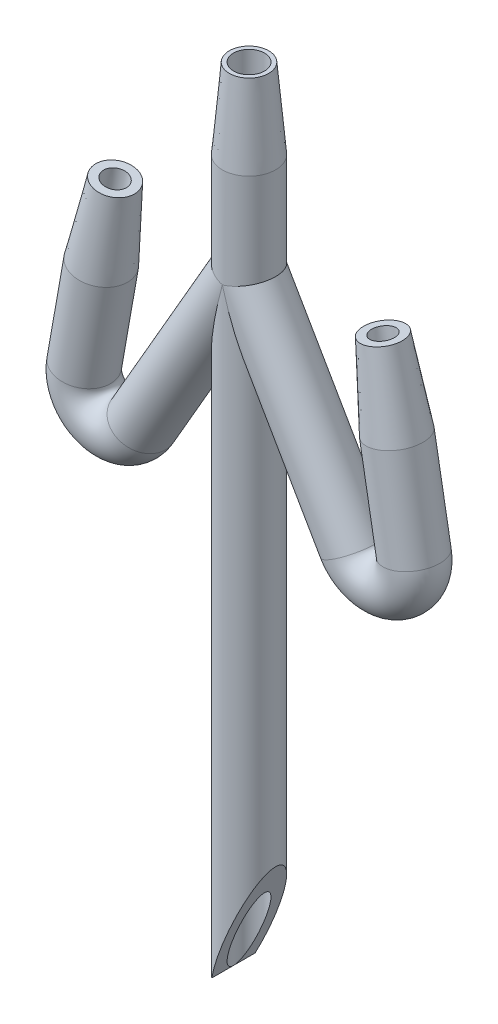
ISO-10303-21;
HEADER;
FILE_DESCRIPTION(('STEP AP214'),'2;1');
FILE_NAME('part.step','',(''),(''),'','','');
FILE_SCHEMA(('AUTOMOTIVE_DESIGN { 1 0 10303 214 1 1 1 1 }'));
ENDSEC;
DATA;
#1=APPLICATION_CONTEXT('core data for automotive mechanical design processes');
#2=APPLICATION_PROTOCOL_DEFINITION('international standard','automotive_design',2000,#1);
#3=PRODUCT_CONTEXT('',#1,'mechanical');
#4=PRODUCT('Part','Part','',(#3));
#5=PRODUCT_RELATED_PRODUCT_CATEGORY('part','',(#4));
#6=PRODUCT_DEFINITION_FORMATION('','',#4);
#7=PRODUCT_DEFINITION_CONTEXT('part definition',#1,'design');
#8=PRODUCT_DEFINITION('design','',#6,#7);
#9=PRODUCT_DEFINITION_SHAPE('','',#8);
#10=(LENGTH_UNIT() NAMED_UNIT(*) SI_UNIT(.MILLI.,.METRE.));
#11=(NAMED_UNIT(*) PLANE_ANGLE_UNIT() SI_UNIT($,.RADIAN.));
#12=(NAMED_UNIT(*) SI_UNIT($,.STERADIAN.) SOLID_ANGLE_UNIT());
#13=UNCERTAINTY_MEASURE_WITH_UNIT(LENGTH_MEASURE(1.E-05),#10,'distance_accuracy_value','');
#14=(GEOMETRIC_REPRESENTATION_CONTEXT(3) GLOBAL_UNCERTAINTY_ASSIGNED_CONTEXT((#13)) GLOBAL_UNIT_ASSIGNED_CONTEXT((#10,
#11,#12)) REPRESENTATION_CONTEXT('',''));
#15=CARTESIAN_POINT('',(0.,0.,0.));
#16=DIRECTION('',(0.,0.,1.));
#17=DIRECTION('',(1.,0.,0.));
#18=AXIS2_PLACEMENT_3D('',#15,#16,#17);
#19=CARTESIAN_POINT('',(0.,88.9,0.));
#20=DIRECTION('',(0.,-1.,0.));
#21=DIRECTION('',(0.,0.,-1.));
#22=AXIS2_PLACEMENT_3D('',#19,#20,#21);
#23=CYLINDRICAL_SURFACE('',#22,3.);
#24=CARTESIAN_POINT('',(0.,79.9,0.));
#25=DIRECTION('',(0.,1.,0.));
#26=DIRECTION('',(0.,0.,1.));
#27=AXIS2_PLACEMENT_3D('',#24,#25,#26);
#28=CIRCLE('',#27,3.);
#29=CARTESIAN_POINT('',(0.,79.9,3.));
#30=VERTEX_POINT('',#29);
#31=EDGE_CURVE('E11',#30,#30,#28,.F.);
#32=ORIENTED_EDGE('',*,*,#31,.T.);
#33=EDGE_LOOP('',(#32));
#34=FACE_BOUND('',#33,.T.);
#35=CARTESIAN_POINT('',(0.,68.6961524227066,0.));
#36=DIRECTION('',(0.258819045102523,-0.965925826289068,0.));
#37=DIRECTION('',(0.965925826289068,0.258819045102523,0.));
#38=AXIS2_PLACEMENT_3D('',#35,#36,#37);
#39=ELLIPSE('',#38,3.10582854123025,3.);
#40=CARTESIAN_POINT('',(0.,68.6961524227065,3.));
#41=VERTEX_POINT('',#40);
#42=CARTESIAN_POINT('',(0.,68.6961524227066,-3.));
#43=VERTEX_POINT('',#42);
#44=EDGE_CURVE('E79',#41,#43,#39,.F.);
#45=ORIENTED_EDGE('',*,*,#44,.T.);
#46=CARTESIAN_POINT('',(0.,68.6961524227065,0.));
#47=DIRECTION('',(-0.258819045102523,-0.965925826289068,0.));
#48=DIRECTION('',(-0.965925826289068,0.258819045102523,0.));
#49=AXIS2_PLACEMENT_3D('',#46,#47,#48);
#50=ELLIPSE('',#49,3.10582854123025,3.);
#51=EDGE_CURVE('E70',#41,#43,#50,.T.);
#52=ORIENTED_EDGE('',*,*,#51,.F.);
#53=EDGE_LOOP('',(#45,#52));
#54=FACE_BOUND('',#53,.T.);
#55=ADVANCED_FACE('F32',(#34,#54),#23,.T.);
#56=CARTESIAN_POINT('',(0.,4.42105263157895,0.));
#57=DIRECTION('',(0.929806613071272,-0.368048451007378,0.));
#58=DIRECTION('',(-0.368048451007378,-0.929806613071272,0.));
#59=AXIS2_PLACEMENT_3D('',#56,#57,#58);
#60=ELLIPSE('',#59,8.15110073629914,3.);
#61=CARTESIAN_POINT('',(-1.75,0.,-2.43669858620224));
#62=VERTEX_POINT('',#61);
#63=CARTESIAN_POINT('',(-1.75,0.,2.43669858620224));
#64=VERTEX_POINT('',#63);
#65=EDGE_CURVE('E47',#62,#64,#60,.T.);
#66=ORIENTED_EDGE('',*,*,#65,.F.);
#67=CARTESIAN_POINT('',(0.,0.,0.));
#68=DIRECTION('',(0.,1.,0.));
#69=DIRECTION('',(0.,0.,1.));
#70=AXIS2_PLACEMENT_3D('',#67,#68,#69);
#71=CIRCLE('',#70,3.);
#72=EDGE_CURVE('E196',#62,#64,#71,.T.);
#73=ORIENTED_EDGE('',*,*,#72,.T.);
#74=EDGE_LOOP('',(#66,#73));
#75=FACE_BOUND('',#74,.T.);
#76=CARTESIAN_POINT('',(0.,68.6961524227066,0.));
#77=DIRECTION('',(0.965925826289068,0.258819045102523,0.));
#78=DIRECTION('',(0.258819045102523,-0.965925826289068,0.));
#79=AXIS2_PLACEMENT_3D('',#76,#77,#78);
#80=ELLIPSE('',#79,11.5911099154687,3.);
#81=EDGE_CURVE('E66',#43,#41,#80,.F.);
#82=ORIENTED_EDGE('',*,*,#81,.T.);
#83=CARTESIAN_POINT('',(0.,68.6961524227065,0.));
#84=DIRECTION('',(-0.965925826289068,0.258819045102523,0.));
#85=DIRECTION('',(-0.258819045102523,-0.965925826289068,0.));
#86=AXIS2_PLACEMENT_3D('',#83,#84,#85);
#87=ELLIPSE('',#86,11.5911099154687,3.);
#88=EDGE_CURVE('E62',#43,#41,#87,.T.);
#89=ORIENTED_EDGE('',*,*,#88,.F.);
#90=EDGE_LOOP('',(#82,#89));
#91=FACE_BOUND('',#90,.T.);
#92=ADVANCED_FACE('F64',(#75,#91),#23,.T.);
#93=CARTESIAN_POINT('',(0.,88.9,0.));
#94=DIRECTION('',(0.,-1.,0.));
#95=DIRECTION('',(0.,0.,-1.));
#96=AXIS2_PLACEMENT_3D('',#93,#94,#95);
#97=CYLINDRICAL_SURFACE('',#96,1.75);
#98=CARTESIAN_POINT('',(0.,4.42105263157895,0.));
#99=DIRECTION('',(0.929806613071272,-0.368048451007378,0.));
#100=DIRECTION('',(-0.368048451007378,-0.929806613071272,0.));
#101=AXIS2_PLACEMENT_3D('',#98,#99,#100);
#102=ELLIPSE('',#101,4.75480876284117,1.75);
#103=CARTESIAN_POINT('',(-1.75,0.,0.));
#104=VERTEX_POINT('',#103);
#105=EDGE_CURVE('E52',#104,#104,#102,.T.);
#106=ORIENTED_EDGE('',*,*,#105,.T.);
#107=EDGE_LOOP('',(#106));
#108=FACE_BOUND('',#107,.T.);
#109=CARTESIAN_POINT('',(0.,88.9,0.));
#110=DIRECTION('',(0.,1.,0.));
#111=DIRECTION('',(0.,0.,1.));
#112=AXIS2_PLACEMENT_3D('',#109,#110,#111);
#113=CIRCLE('',#112,1.75);
#114=CARTESIAN_POINT('',(0.,88.9,1.75));
#115=VERTEX_POINT('',#114);
#116=EDGE_CURVE('E194',#115,#115,#113,.T.);
#117=ORIENTED_EDGE('',*,*,#116,.T.);
#118=EDGE_LOOP('',(#117));
#119=FACE_BOUND('',#118,.T.);
#120=CARTESIAN_POINT('',(-1.75,64.4650635094611,0.));
#121=CARTESIAN_POINT('',(-1.74999967782924,64.4650657963155,0.0144022437630937));
#122=CARTESIAN_POINT('',(-1.74981974344436,64.4664259852177,0.028817126801205));
#123=CARTESIAN_POINT('',(-1.74912392319116,64.4716996002133,0.057166727863634));
#124=CARTESIAN_POINT('',(-1.74860743427616,64.4756176094959,0.071100536605041));
#125=CARTESIAN_POINT('',(-1.74713179830254,64.4868583619929,0.101581459482267));
#126=CARTESIAN_POINT('',(-1.74609364841494,64.494792266152,0.117896127350237));
#127=CARTESIAN_POINT('',(-1.74371213439526,64.5131246485248,0.149041325044871));
#128=CARTESIAN_POINT('',(-1.74236811009864,64.5235284596325,0.163868543307113));
#129=CARTESIAN_POINT('',(-1.73847370889731,64.5539401708528,0.201974704230325));
#130=CARTESIAN_POINT('',(-1.73573678193026,64.5755780255174,0.223916830563885));
#131=CARTESIAN_POINT('',(-1.73001423295078,64.6216746361816,0.264519343772491));
#132=CARTESIAN_POINT('',(-1.72702794756075,64.6461409879227,0.283170537535171));
#133=CARTESIAN_POINT('',(-1.72071851775594,64.6989616724662,0.319362822507982));
#134=CARTESIAN_POINT('',(-1.71738829230658,64.7274697518859,0.336675400950524));
#135=CARTESIAN_POINT('',(-1.71075351391463,64.7858246439376,0.368905034696997));
#136=CARTESIAN_POINT('',(-1.70744899422182,64.8156729324553,0.383819361871916));
#137=CARTESIAN_POINT('',(-1.6976782474501,64.9067363898538,0.425702937997383));
#138=CARTESIAN_POINT('',(-1.69137264560294,64.9693236952528,0.449720997913106));
#139=CARTESIAN_POINT('',(-1.6793166815534,65.0994500211433,0.492857070926406));
#140=CARTESIAN_POINT('',(-1.67360665322866,65.1670832623893,0.511689803237972));
#141=CARTESIAN_POINT('',(-1.66342241251904,65.303804687399,0.543884454011277));
#142=CARTESIAN_POINT('',(-1.65894960268057,65.3728944276179,0.557240171778001));
#143=CARTESIAN_POINT('',(-1.65157896400475,65.511845128919,0.578717844059665));
#144=CARTESIAN_POINT('',(-1.64867853480283,65.5817046205316,0.586848443902411));
#145=CARTESIAN_POINT('',(-1.64478812432287,65.7218433567063,0.597667222140363));
#146=CARTESIAN_POINT('',(-1.64379622005349,65.792122107115,0.60036087882447));
#147=CARTESIAN_POINT('',(-1.64408681387714,65.9318599544533,0.599566257573265));
#148=CARTESIAN_POINT('',(-1.64534335767751,66.0013192077901,0.596148524963205));
#149=CARTESIAN_POINT('',(-1.6504399951481,66.1394149322064,0.581905835443533));
#150=CARTESIAN_POINT('',(-1.65427791617976,66.2080520458413,0.571087107515163));
#151=CARTESIAN_POINT('',(-1.66365031217651,66.3289667916924,0.543078855272738));
#152=CARTESIAN_POINT('',(-1.66866853228566,66.3816875383998,0.527673695348891));
#153=CARTESIAN_POINT('',(-1.68034243132295,66.4841257498108,0.489245928747003));
#154=CARTESIAN_POINT('',(-1.68699431584352,66.5338498460064,0.466240931588176));
#155=CARTESIAN_POINT('',(-1.69862860468098,66.6100000403414,0.421273816173346));
#156=CARTESIAN_POINT('',(-1.70329807998176,66.6381553905885,0.40217308471599));
#157=CARTESIAN_POINT('',(-1.71271968125644,66.6912695341783,0.35994413337159));
#158=CARTESIAN_POINT('',(-1.71747168735932,66.7162325844332,0.336821376089838));
#159=CARTESIAN_POINT('',(-1.72574204118773,66.7574674990413,0.291113834815033));
#160=CARTESIAN_POINT('',(-1.72932570825414,66.7744925865,0.2692250164275));
#161=CARTESIAN_POINT('',(-1.73590738815141,66.8047703933485,0.222872116911661));
#162=CARTESIAN_POINT('',(-1.7389056164695,66.8180245015777,0.198408988452455));
#163=CARTESIAN_POINT('',(-1.74399094456511,66.8400463397497,0.14717972819608));
#164=CARTESIAN_POINT('',(-1.74607024804382,66.8487757855542,0.120396112701944));
#165=CARTESIAN_POINT('',(-1.74898507238961,66.8609168844585,0.065583223951246));
#166=CARTESIAN_POINT('',(-1.74982162024855,66.8643329285719,0.0375549989697012));
#167=CARTESIAN_POINT('',(-1.75010593362122,66.8654970923788,-0.0147173541198623));
#168=CARTESIAN_POINT('',(-1.74973023081741,66.8639656397361,-0.0389471353331247));
#169=CARTESIAN_POINT('',(-1.74801137034396,66.8568669643391,-0.0867655994173777));
#170=CARTESIAN_POINT('',(-1.74666836993793,66.8513003976144,-0.110354385854697));
#171=CARTESIAN_POINT('',(-1.74320086860381,66.8366191889956,-0.155752537929573));
#172=CARTESIAN_POINT('',(-1.74109406256437,66.8275846305288,-0.177589502407519));
#173=CARTESIAN_POINT('',(-1.73629328790374,66.8064141769206,-0.219622299385194));
#174=CARTESIAN_POINT('',(-1.73359911324072,66.7942771932276,-0.23981755257087));
#175=CARTESIAN_POINT('',(-1.72670107353083,66.7620996335445,-0.285902764125763));
#176=CARTESIAN_POINT('',(-1.72232023456567,66.7408280883915,-0.310907894281748));
#177=CARTESIAN_POINT('',(-1.71334347660722,66.6945081057977,-0.357085275280826));
#178=CARTESIAN_POINT('',(-1.70874713432729,66.6694520004632,-0.378249548002124));
#179=CARTESIAN_POINT('',(-1.6977013621842,66.6047807735987,-0.425611455051361));
#180=CARTESIAN_POINT('',(-1.69134763470024,66.5636838727508,-0.449795503742886));
#181=CARTESIAN_POINT('',(-1.67967484782126,66.4781836065856,-0.491590398474707));
#182=CARTESIAN_POINT('',(-1.67435761599303,66.4337745884773,-0.509189683477354));
#183=CARTESIAN_POINT('',(-1.66573692985128,66.350173400741,-0.536647586104307));
#184=CARTESIAN_POINT('',(-1.66224872627558,66.3112481436257,-0.547285452423902));
#185=CARTESIAN_POINT('',(-1.65620903896644,66.232567689766,-0.565296256616595));
#186=CARTESIAN_POINT('',(-1.65365822710848,66.192811919237,-0.572666853451822));
#187=CARTESIAN_POINT('',(-1.64736379043802,66.0726138691492,-0.590651258660524));
#188=CARTESIAN_POINT('',(-1.6450006695552,65.9914648611183,-0.597071486330873));
#189=CARTESIAN_POINT('',(-1.64354572730632,65.8400639359947,-0.601038335238441));
#190=CARTESIAN_POINT('',(-1.64405380881221,65.769826322438,-0.599670059278626));
#191=CARTESIAN_POINT('',(-1.64705291775742,65.6296526102127,-0.591386832212747));
#192=CARTESIAN_POINT('',(-1.6495458708731,65.559716870696,-0.584466494575411));
#193=CARTESIAN_POINT('',(-1.65615795336084,65.4208571001336,-0.565456213214872));
#194=CARTESIAN_POINT('',(-1.66027214776122,65.3519306511458,-0.553381948573587));
#195=CARTESIAN_POINT('',(-1.66980203777916,65.2153616804124,-0.523932262522137));
#196=CARTESIAN_POINT('',(-1.67521636364355,65.1477178877165,-0.506562415113301));
#197=CARTESIAN_POINT('',(-1.68470029414649,65.0406157051937,-0.473760402469363));
#198=CARTESIAN_POINT('',(-1.68846082385498,65.000539242412,-0.46025476757722));
#199=CARTESIAN_POINT('',(-1.69626381067554,64.9213191585745,-0.430609503515983));
#200=CARTESIAN_POINT('',(-1.70030672978824,64.8821772137475,-0.414465497194957));
#201=CARTESIAN_POINT('',(-1.70917110193847,64.7996974630063,-0.376401145512029));
#202=CARTESIAN_POINT('',(-1.71401997415626,64.7565826320717,-0.353981401601094));
#203=CARTESIAN_POINT('',(-1.72124973074329,64.6945405033158,-0.316164290400013));
#204=CARTESIAN_POINT('',(-1.72364873283184,64.6743272385583,-0.30288430735564));
#205=CARTESIAN_POINT('',(-1.72837529579794,64.6351191466309,-0.274636346716059));
#206=CARTESIAN_POINT('',(-1.73070293919485,64.6161228820882,-0.25967042023995));
#207=CARTESIAN_POINT('',(-1.7347410569793,64.5836021615469,-0.230950631440091));
#208=CARTESIAN_POINT('',(-1.73648052091051,64.5697523185699,-0.217573002687915));
#209=CARTESIAN_POINT('',(-1.73979207189458,64.5436222332122,-0.189279382761899));
#210=CARTESIAN_POINT('',(-1.7413639152341,64.5313442712202,-0.174361212059098));
#211=CARTESIAN_POINT('',(-1.74425619128716,64.508912980605,-0.142581292483764));
#212=CARTESIAN_POINT('',(-1.7455722125284,64.4987966767122,-0.125692331011889));
#213=CARTESIAN_POINT('',(-1.74775963202233,64.4820602614523,-0.0902536819768896));
#214=CARTESIAN_POINT('',(-1.74863334180382,64.4754219674309,-0.071713236480717));
#215=CARTESIAN_POINT('',(-1.74946750946716,64.4690947872168,-0.0440323183079523));
#216=CARTESIAN_POINT('',(-1.7496660906405,64.4675908392054,-0.035298464424195));
#217=CARTESIAN_POINT('',(-1.74993245191926,64.4655743686878,-0.0177113543209565));
#218=CARTESIAN_POINT('',(-1.75000019815041,64.4650621029364,-0.00885806777664132));
#219=CARTESIAN_POINT('',(-1.75,64.4650635094611,0.));
#220=B_SPLINE_CURVE_WITH_KNOTS('',3,(#120,#121,#122,#123,#124,#125,#126,#127,#128,#129,#130,
#131,#132,#133,#134,#135,#136,#137,#138,#139,#140,#141,#142,#143,#144,#145,#146,#147,#148,#149,
#150,#151,#152,#153,#154,#155,#156,#157,#158,#159,#160,#161,#162,#163,#164,#165,#166,#167,#168,
#169,#170,#171,#172,#173,#174,#175,#176,#177,#178,#179,#180,#181,#182,#183,#184,#185,#186,#187,
#188,#189,#190,#191,#192,#193,#194,#195,#196,#197,#198,#199,#200,#201,#202,#203,#204,#205,#206,
#207,#208,#209,#210,#211,#212,#213,#214,#215,#216,#217,#218,#219),.UNSPECIFIED.,.T.,.F.,(4,2,2,
2,2,2,2,2,2,2,2,2,2,2,2,2,2,2,2,2,2,2,2,2,2,2,2,2,2,2,2,2,2,2,2,2,2,2,2,2,2,2,2,2,2,2,2,2,2,4),
(0.,0.0431678813126581,0.0864133253845893,0.140616642509254,0.194938074409648,0.287230089916701,
0.379775973337152,0.480175259794171,0.580687959565218,0.782230177273864,0.993298968153461,
1.20460606110381,1.41556262517877,1.62630652212627,1.83463343054168,2.04278521785444,
2.2078104961902,2.3724560468518,2.47518317624196,2.57777185860341,2.66132906720018,
2.74485546199336,2.82907750601135,2.91322991159056,2.98571031889228,3.05817894496107,
3.12906603577782,3.19997803305763,3.2987842777245,3.39779346773517,3.54130612177943,
3.68506957526258,3.80640587989593,3.92782898347716,4.1713716785466,4.3818936442656,
4.59262010275024,4.80271001548285,5.01257955173248,5.13987576509654,5.26738535221526,
5.41353284256939,5.4863827352241,5.55914493682069,5.61705365266178,5.67504544922731,
5.73396252108456,5.79256842763841,5.81911186497616,5.84566217371495),.UNSPECIFIED.);
#221=CARTESIAN_POINT('',(-1.75,64.4650635094611,0.));
#222=VERTEX_POINT('',#221);
#223=EDGE_CURVE('E69',#222,#222,#220,.T.);
#224=ORIENTED_EDGE('',*,*,#223,.T.);
#225=EDGE_LOOP('',(#224));
#226=FACE_BOUND('',#225,.T.);
#227=CARTESIAN_POINT('',(1.75,66.8650635094611,0.));
#228=CARTESIAN_POINT('',(1.74999934538002,66.8650618865602,-0.0257575407768746));
#229=CARTESIAN_POINT('',(1.74942442113619,66.8627154326438,-0.0515261011185308));
#230=CARTESIAN_POINT('',(1.74719833649222,66.8534886163495,-0.102192129925877));
#231=CARTESIAN_POINT('',(1.74554638092465,66.8466049040928,-0.127088940461113));
#232=CARTESIAN_POINT('',(1.7413799173201,66.8287985725914,-0.175144406933154));
#233=CARTESIAN_POINT('',(1.73887009421107,66.8178978659364,-0.198311687807514));
#234=CARTESIAN_POINT('',(1.73324839636274,66.7926564765402,-0.24258874115657));
#235=CARTESIAN_POINT('',(1.73013631111688,66.7783145905941,-0.263697790333941));
#236=CARTESIAN_POINT('',(1.72240279014223,66.7411843579435,-0.310782113369198));
#237=CARTESIAN_POINT('',(1.7176396472944,66.7172097424317,-0.335797170050267));
#238=CARTESIAN_POINT('',(1.70805036903912,66.6655304057504,-0.381592486445967));
#239=CARTESIAN_POINT('',(1.70322412814084,66.6378184391157,-0.402364318209808));
#240=CARTESIAN_POINT('',(1.69161815192663,66.5656324420249,-0.44918823788523));
#241=CARTESIAN_POINT('',(1.68503751952363,66.5195894198462,-0.472853726291026));
#242=CARTESIAN_POINT('',(1.67325022865103,66.4243421609894,-0.512997881117648));
#243=CARTESIAN_POINT('',(1.66804649332589,66.3751314702249,-0.529461305212746));
#244=CARTESIAN_POINT('',(1.65979460457016,66.2818542853663,-0.554733666424952));
#245=CARTESIAN_POINT('',(1.6565496349464,66.2379973292984,-0.564278700157163));
#246=CARTESIAN_POINT('',(1.65119964699118,66.1495631707262,-0.579746951244563));
#247=CARTESIAN_POINT('',(1.64909550308267,66.1049854426365,-0.585667390859475));
#248=CARTESIAN_POINT('',(1.64595653419576,66.0154053671219,-0.594430939318128));
#249=CARTESIAN_POINT('',(1.64492403926963,65.9704023082446,-0.597267343275287));
#250=CARTESIAN_POINT('',(1.64384212407438,65.8802905487562,-0.600237197008605));
#251=CARTESIAN_POINT('',(1.64379302307328,65.8351818185914,-0.600369768960714));
#252=CARTESIAN_POINT('',(1.64481819660683,65.7176052125877,-0.597561408600811));
#253=CARTESIAN_POINT('',(1.64659396099089,65.6451856440457,-0.592701885508357));
#254=CARTESIAN_POINT('',(1.65203618798909,65.500954627757,-0.577357578287653));
#255=CARTESIAN_POINT('',(1.65570475693604,65.4291439482669,-0.566866526808951));
#256=CARTESIAN_POINT('',(1.6645811036273,65.2864100025921,-0.540247653524163));
#257=CARTESIAN_POINT('',(1.66979421947631,65.2154907181907,-0.524100246924415));
#258=CARTESIAN_POINT('',(1.68139499786975,65.0755122380681,-0.485617928730619));
#259=CARTESIAN_POINT('',(1.68778065334857,65.0064500915764,-0.463293557797646));
#260=CARTESIAN_POINT('',(1.69776155402201,64.9068735014531,-0.424578439273093));
#261=CARTESIAN_POINT('',(1.70106292452785,64.8751463026504,-0.411220299062858));
#262=CARTESIAN_POINT('',(1.7077747200552,64.8126851306941,-0.382395424072146));
#263=CARTESIAN_POINT('',(1.71118507075887,64.7819505082545,-0.366930103723636));
#264=CARTESIAN_POINT('',(1.71799837463481,64.72219473961,-0.333570370171906));
#265=CARTESIAN_POINT('',(1.72140109616355,64.6931602056094,-0.315700149366866));
#266=CARTESIAN_POINT('',(1.72809127734644,64.6373475935098,-0.276754362523848));
#267=CARTESIAN_POINT('',(1.73137905983095,64.6105628386826,-0.255688842107469));
#268=CARTESIAN_POINT('',(1.73637062482275,64.5706099451569,-0.218441118002573));
#269=CARTESIAN_POINT('',(1.73818930679799,64.5562260004327,-0.203591192282659));
#270=CARTESIAN_POINT('',(1.7415925308873,64.5295501332762,-0.172066055468619));
#271=CARTESIAN_POINT('',(1.74317734641042,64.5172557653631,-0.155393016106747));
#272=CARTESIAN_POINT('',(1.74559647275767,64.4986114313716,-0.124748850239635));
#273=CARTESIAN_POINT('',(1.74651849456416,64.4915488022983,-0.111224111834521));
#274=CARTESIAN_POINT('',(1.74807694799196,64.4796509362076,-0.0832050392670694));
#275=CARTESIAN_POINT('',(1.74871372101098,64.4748130363559,-0.0687118881560488));
#276=CARTESIAN_POINT('',(1.74963185805639,64.4678475026655,-0.0388902349003573));
#277=CARTESIAN_POINT('',(1.74990930503509,64.4657497372161,-0.0235543952829279));
#278=CARTESIAN_POINT('',(1.75005261076731,64.4646654124039,0.00722685785613545));
#279=CARTESIAN_POINT('',(1.74991868847577,64.4656771979551,0.0226722087230651));
#280=CARTESIAN_POINT('',(1.74931103973881,64.470280897802,0.0507854892331671));
#281=CARTESIAN_POINT('',(1.74889083383159,64.4734665438656,0.0635247530253516));
#282=CARTESIAN_POINT('',(1.74781123078052,64.4816792142304,0.0883787410373905));
#283=CARTESIAN_POINT('',(1.74715169776646,64.4867072845241,0.100493106020216));
#284=CARTESIAN_POINT('',(1.74520480871955,64.5016169632943,0.130793059372627));
#285=CARTESIAN_POINT('',(1.74377537057684,64.5126208369048,0.148413780365441));
#286=CARTESIAN_POINT('',(1.74061676141902,64.5371702776817,0.181755078529164));
#287=CARTESIAN_POINT('',(1.73888665633346,64.5507237768255,0.197469467068716));
#288=CARTESIAN_POINT('',(1.73370585127386,64.5917742605029,0.239874680694661));
#289=CARTESIAN_POINT('',(1.73004369685245,64.6213229758475,0.264528293797423));
#290=CARTESIAN_POINT('',(1.72254784183696,64.6834185897705,0.309589845672081));
#291=CARTESIAN_POINT('',(1.71871371008473,64.7159732685904,0.329986294711524));
#292=CARTESIAN_POINT('',(1.71054807150105,64.7874818202774,0.370135464908219));
#293=CARTESIAN_POINT('',(1.70622070450837,64.8266999126403,0.389413605797098));
#294=CARTESIAN_POINT('',(1.69776910892759,64.9066031949571,0.424744452908575));
#295=CARTESIAN_POINT('',(1.69364512591398,64.9472900604851,0.440793328640382));
#296=CARTESIAN_POINT('',(1.68570094152312,65.029791567652,0.470261091045478));
#297=CARTESIAN_POINT('',(1.68188187802218,65.0716097189519,0.483670377394763));
#298=CARTESIAN_POINT('',(1.6746529576022,65.1559679862871,0.508132980315417));
#299=CARTESIAN_POINT('',(1.67124321576486,65.1985083015411,0.519185634989252));
#300=CARTESIAN_POINT('',(1.6629064222857,65.311287454928,0.545470539419672));
#301=CARTESIAN_POINT('',(1.65838873197447,65.3819806242935,0.558907274562822));
#302=CARTESIAN_POINT('',(1.65100814919969,65.5243371317287,0.580343478652644));
#303=CARTESIAN_POINT('',(1.64814690853357,65.5960013655277,0.588337521586388));
#304=CARTESIAN_POINT('',(1.64446770662024,65.7394291987085,0.598544525461276));
#305=CARTESIAN_POINT('',(1.64363911473192,65.8111903086648,0.600787566622349));
#306=CARTESIAN_POINT('',(1.64439560911279,65.9545507896087,0.598723848832535));
#307=CARTESIAN_POINT('',(1.64597685908977,66.0261502363244,0.59442750012642));
#308=CARTESIAN_POINT('',(1.65099382510893,66.1461645731549,0.580304434537673));
#309=CARTESIAN_POINT('',(1.65369894390747,66.1948577762831,0.572615863203927));
#310=CARTESIAN_POINT('',(1.66050750597454,66.2912538600305,0.552566620504301));
#311=CARTESIAN_POINT('',(1.6646120394951,66.3389559376517,0.540202305551058));
#312=CARTESIAN_POINT('',(1.67423426233342,66.43287165497,0.509609798320321));
#313=CARTESIAN_POINT('',(1.67976549973945,66.4790659566293,0.491324933680913));
#314=CARTESIAN_POINT('',(1.69194199668638,66.5678089004697,0.447604531800282));
#315=CARTESIAN_POINT('',(1.69858427385198,66.6103668535861,0.422188017563));
#316=CARTESIAN_POINT('',(1.70960044903773,66.6741235159477,0.374316006910273));
#317=CARTESIAN_POINT('',(1.71387153407894,66.6972709666108,0.354438669083627));
#318=CARTESIAN_POINT('',(1.72222163354269,66.7402795249136,0.311341883741537));
#319=CARTESIAN_POINT('',(1.72630084356238,66.7601440335043,0.288125942077593));
#320=CARTESIAN_POINT('',(1.73330060305539,66.7929482951715,0.242130290096613));
#321=CARTESIAN_POINT('',(1.7363033472384,66.8064761889424,0.219784944346833));
#322=CARTESIAN_POINT('',(1.74157569900104,66.8296891132586,0.173098432180861));
#323=CARTESIAN_POINT('',(1.7438461530937,66.839378583926,0.148759611308967));
#324=CARTESIAN_POINT('',(1.74703930407707,66.8528363992621,0.103715498630748));
#325=CARTESIAN_POINT('',(1.74814091429722,66.8574022282336,0.083259562672463));
#326=CARTESIAN_POINT('',(1.74962154345115,66.8635165060842,0.041871525247048));
#327=CARTESIAN_POINT('',(1.75000053216851,66.8650648287864,0.0209394039052619));
#328=CARTESIAN_POINT('',(1.75,66.8650635094611,0.));
#329=B_SPLINE_CURVE_WITH_KNOTS('',3,(#227,#228,#229,#230,#231,#232,#233,#234,#235,#236,#237,
#238,#239,#240,#241,#242,#243,#244,#245,#246,#247,#248,#249,#250,#251,#252,#253,#254,#255,#256,
#257,#258,#259,#260,#261,#262,#263,#264,#265,#266,#267,#268,#269,#270,#271,#272,#273,#274,#275,
#276,#277,#278,#279,#280,#281,#282,#283,#284,#285,#286,#287,#288,#289,#290,#291,#292,#293,#294,
#295,#296,#297,#298,#299,#300,#301,#302,#303,#304,#305,#306,#307,#308,#309,#310,#311,#312,#313,
#314,#315,#316,#317,#318,#319,#320,#321,#322,#323,#324,#325,#326,#327,#328),.UNSPECIFIED.,.T.,
.F.,(4,2,2,2,2,2,2,2,2,2,2,2,2,2,2,2,2,2,2,2,2,2,2,2,2,2,2,2,2,2,2,2,2,2,2,2,2,2,2,2,2,2,2,2,2,
2,2,2,2,2,4),(0.,0.0771827293624633,0.154422507017376,0.23124703467083,0.30809846318597,
0.412439481667833,0.516985770710013,0.672666761378738,0.828675657163285,0.96348727637257,
1.09840208077287,1.23360961551806,1.36886104594049,1.5863826888011,1.80414691578811,
2.02267271527898,2.24082788780425,2.34451884983687,2.44814054971678,2.5507884948033,
2.65312017170161,2.71525415128218,2.77731490566927,2.82301555984553,2.86866137046451,
2.91480069460139,2.96091546493003,3.00016927476623,3.03944540463494,3.10155523962178,
3.16386159559443,3.27918190206261,3.3948095349042,3.52634423729753,3.65803405553506,
3.79019432894073,3.92239167290967,4.13843837339235,4.35470014434628,4.56982844369757,
4.78461463206296,4.9325328356386,5.08056654323777,5.23006135369762,5.37916113088826,
5.4713012783407,5.56334536698436,5.64190490821894,5.72037330793888,5.78311581830514,
5.84586095219161),.UNSPECIFIED.);
#330=CARTESIAN_POINT('',(1.75,66.8650635094611,0.));
#331=VERTEX_POINT('',#330);
#332=EDGE_CURVE('E81',#331,#331,#329,.T.);
#333=ORIENTED_EDGE('',*,*,#332,.F.);
#334=EDGE_LOOP('',(#333));
#335=FACE_BOUND('',#334,.T.);
#336=ADVANCED_FACE('F152',(#108,#119,#226,#335),#97,.F.);
#337=CARTESIAN_POINT('',(0.,0.,0.));
#338=DIRECTION('',(0.,1.,0.));
#339=DIRECTION('',(0.,0.,1.));
#340=AXIS2_PLACEMENT_3D('',#337,#338,#339);
#341=PLANE('',#340);
#342=DIRECTION('',(0.,0.,1.));
#343=VECTOR('',#342,1.);
#344=CARTESIAN_POINT('',(-1.75,0.,-3.));
#345=LINE('',#344,#343);
#346=EDGE_CURVE('E259',#104,#64,#345,.T.);
#347=ORIENTED_EDGE('',*,*,#346,.T.);
#348=ORIENTED_EDGE('',*,*,#72,.F.);
#349=EDGE_CURVE('E200',#62,#104,#345,.T.);
#350=ORIENTED_EDGE('',*,*,#349,.T.);
#351=EDGE_LOOP('',(#347,#348,#350));
#352=FACE_BOUND('',#351,.T.);
#353=ADVANCED_FACE('F155',(#352),#341,.F.);
#354=CARTESIAN_POINT('',(0.,88.9,0.));
#355=DIRECTION('',(0.,1.,0.));
#356=DIRECTION('',(0.,0.,1.));
#357=AXIS2_PLACEMENT_3D('',#354,#355,#356);
#358=PLANE('',#357);
#359=CARTESIAN_POINT('',(0.,88.9,0.));
#360=DIRECTION('',(0.,1.,0.));
#361=DIRECTION('',(0.,0.,1.));
#362=AXIS2_PLACEMENT_3D('',#359,#360,#361);
#363=CIRCLE('',#362,2.21260202826672);
#364=CARTESIAN_POINT('',(0.,88.9,2.21260202826672));
#365=VERTEX_POINT('',#364);
#366=EDGE_CURVE('E40',#365,#365,#363,.T.);
#367=ORIENTED_EDGE('',*,*,#366,.T.);
#368=EDGE_LOOP('',(#367));
#369=FACE_BOUND('',#368,.T.);
#370=ORIENTED_EDGE('',*,*,#116,.F.);
#371=EDGE_LOOP('',(#370));
#372=FACE_BOUND('',#371,.T.);
#373=ADVANCED_FACE('F187',(#369,#372),#358,.T.);
#374=CARTESIAN_POINT('',(-1.75,0.,-3.));
#375=DIRECTION('',(0.929806613071272,-0.368048451007378,0.));
#376=DIRECTION('',(0.368048451007378,0.929806613071272,0.));
#377=AXIS2_PLACEMENT_3D('',#374,#375,#376);
#378=PLANE('',#377);
#379=ORIENTED_EDGE('',*,*,#65,.T.);
#380=ORIENTED_EDGE('',*,*,#346,.F.);
#381=ORIENTED_EDGE('',*,*,#105,.F.);
#382=ORIENTED_EDGE('',*,*,#349,.F.);
#383=EDGE_LOOP('',(#379,#380,#381,#382));
#384=FACE_BOUND('',#383,.T.);
#385=ADVANCED_FACE('F191',(#384),#378,.T.);
#386=CARTESIAN_POINT('',(9.49920564076435,85.1492592240551,0.));
#387=DIRECTION('',(-0.500000000000004,-0.866025403784436,0.));
#388=DIRECTION('',(0.866025403784436,-0.500000000000004,0.));
#389=AXIS2_PLACEMENT_3D('',#386,#387,#388);
#390=CYLINDRICAL_SURFACE('',#389,0.599999999999997);
#391=ORIENTED_EDGE('',*,*,#223,.F.);
#392=EDGE_LOOP('',(#391));
#393=FACE_BOUND('',#392,.T.);
#394=CARTESIAN_POINT('',(-12.,47.9115427318802,0.));
#395=DIRECTION('',(-0.500000000000004,-0.866025403784436,0.));
#396=DIRECTION('',(0.866025403784436,-0.500000000000004,0.));
#397=AXIS2_PLACEMENT_3D('',#394,#395,#396);
#398=CIRCLE('',#397,0.600000000000001);
#399=CARTESIAN_POINT('',(-11.4803847577294,47.6115427318802,0.));
#400=VERTEX_POINT('',#399);
#401=EDGE_CURVE('E97',#400,#400,#398,.T.);
#402=ORIENTED_EDGE('',*,*,#401,.T.);
#403=EDGE_LOOP('',(#402));
#404=FACE_BOUND('',#403,.T.);
#405=ADVANCED_FACE('F237',(#393,#404),#390,.F.);
#406=CARTESIAN_POINT('',(9.49920564076437,85.1492592240551,0.));
#407=DIRECTION('',(-0.500000000000004,-0.866025403784436,0.));
#408=DIRECTION('',(0.866025403784436,-0.500000000000004,0.));
#409=AXIS2_PLACEMENT_3D('',#406,#407,#408);
#410=CYLINDRICAL_SURFACE('',#409,3.);
#411=ORIENTED_EDGE('',*,*,#88,.T.);
#412=ORIENTED_EDGE('',*,*,#51,.T.);
#413=EDGE_LOOP('',(#411,#412));
#414=FACE_BOUND('',#413,.T.);
#415=CARTESIAN_POINT('',(-12.,47.9115427318802,0.));
#416=DIRECTION('',(-0.500000000000004,-0.866025403784436,0.));
#417=DIRECTION('',(0.866025403784436,-0.500000000000004,0.));
#418=AXIS2_PLACEMENT_3D('',#415,#416,#417);
#419=CIRCLE('',#418,3.);
#420=CARTESIAN_POINT('',(-9.40192378864674,46.4115427318802,0.));
#421=VERTEX_POINT('',#420);
#422=EDGE_CURVE('E77',#421,#421,#419,.T.);
#423=ORIENTED_EDGE('',*,*,#422,.F.);
#424=EDGE_LOOP('',(#423));
#425=FACE_BOUND('',#424,.T.);
#426=ADVANCED_FACE('F73',(#414,#425),#410,.T.);
#427=CARTESIAN_POINT('',(-12.3987246936027,90.1713735410851,0.));
#428=DIRECTION('',(0.500000000000004,-0.866025403784436,0.));
#429=DIRECTION('',(0.866025403784436,0.500000000000004,0.));
#430=AXIS2_PLACEMENT_3D('',#427,#428,#429);
#431=CYLINDRICAL_SURFACE('',#430,0.599999999999997);
#432=ORIENTED_EDGE('',*,*,#332,.T.);
#433=EDGE_LOOP('',(#432));
#434=FACE_BOUND('',#433,.T.);
#435=CARTESIAN_POINT('',(12.,47.9115427318802,0.));
#436=DIRECTION('',(-0.500000000000004,0.866025403784436,0.));
#437=DIRECTION('',(-0.866025403784436,-0.500000000000004,0.));
#438=AXIS2_PLACEMENT_3D('',#435,#436,#437);
#439=CIRCLE('',#438,0.600000000000001);
#440=CARTESIAN_POINT('',(11.4803847577294,47.6115427318802,0.));
#441=VERTEX_POINT('',#440);
#442=EDGE_CURVE('E88',#441,#441,#439,.T.);
#443=ORIENTED_EDGE('',*,*,#442,.F.);
#444=EDGE_LOOP('',(#443));
#445=FACE_BOUND('',#444,.T.);
#446=ADVANCED_FACE('F99',(#434,#445),#431,.F.);
#447=CARTESIAN_POINT('',(-12.3987246936028,90.1713735410851,0.));
#448=DIRECTION('',(0.500000000000004,-0.866025403784436,0.));
#449=DIRECTION('',(0.866025403784436,0.500000000000004,0.));
#450=AXIS2_PLACEMENT_3D('',#447,#448,#449);
#451=CYLINDRICAL_SURFACE('',#450,3.);
#452=ORIENTED_EDGE('',*,*,#44,.F.);
#453=ORIENTED_EDGE('',*,*,#81,.F.);
#454=EDGE_LOOP('',(#452,#453));
#455=FACE_BOUND('',#454,.T.);
#456=CARTESIAN_POINT('',(12.,47.9115427318802,0.));
#457=DIRECTION('',(-0.500000000000004,0.866025403784436,0.));
#458=DIRECTION('',(-0.866025403784436,-0.500000000000004,0.));
#459=AXIS2_PLACEMENT_3D('',#456,#457,#458);
#460=CIRCLE('',#459,3.);
#461=CARTESIAN_POINT('',(9.40192378864674,46.4115427318802,0.));
#462=VERTEX_POINT('',#461);
#463=EDGE_CURVE('E85',#462,#462,#460,.T.);
#464=ORIENTED_EDGE('',*,*,#463,.T.);
#465=EDGE_LOOP('',(#464));
#466=FACE_BOUND('',#465,.T.);
#467=ADVANCED_FACE('F83',(#455,#466),#451,.T.);
#468=CARTESIAN_POINT('',(-18.5393227909065,50.2916615800287,0.));
#469=DIRECTION('',(0.173648177666934,0.984807753012207,0.));
#470=DIRECTION('',(-0.984807753012207,0.173648177666934,0.));
#471=AXIS2_PLACEMENT_3D('',#468,#469,#470);
#472=CYLINDRICAL_SURFACE('',#471,3.);
#473=CARTESIAN_POINT('',(-16.6291928365707,61.1245468631601,0.));
#474=DIRECTION('',(0.173648177666934,0.984807753012207,0.));
#475=DIRECTION('',(-0.984807753012207,0.173648177666934,0.));
#476=AXIS2_PLACEMENT_3D('',#473,#474,#475);
#477=CIRCLE('',#476,3.);
#478=CARTESIAN_POINT('',(-19.5836160956074,61.6454913961609,0.));
#479=VERTEX_POINT('',#478);
#480=EDGE_CURVE('E174',#479,#479,#477,.F.);
#481=ORIENTED_EDGE('',*,*,#480,.T.);
#482=EDGE_LOOP('',(#481));
#483=FACE_BOUND('',#482,.T.);
#484=CARTESIAN_POINT('',(-18.5393227909065,50.2916615800287,0.));
#485=DIRECTION('',(0.173648177666939,0.984807753012206,0.));
#486=DIRECTION('',(-0.984807753012207,0.173648177666939,0.));
#487=AXIS2_PLACEMENT_3D('',#484,#485,#486);
#488=CIRCLE('',#487,3.);
#489=CARTESIAN_POINT('',(-21.4937460499431,50.8126061130295,0.));
#490=VERTEX_POINT('',#489);
#491=EDGE_CURVE('E221',#490,#490,#488,.T.);
#492=ORIENTED_EDGE('',*,*,#491,.T.);
#493=EDGE_LOOP('',(#492));
#494=FACE_BOUND('',#493,.T.);
#495=ADVANCED_FACE('F106',(#483,#494),#472,.T.);
#496=CARTESIAN_POINT('',(-15.0598218103426,49.6781316777537,0.));
#497=DIRECTION('',(0.,0.,1.));
#498=DIRECTION('',(1.,0.,0.));
#499=AXIS2_PLACEMENT_3D('',#496,#497,#498);
#500=TOROIDAL_SURFACE('',#499,3.53317789174713,0.600000000000005);
#501=CARTESIAN_POINT('',(-18.5393227909065,50.2916615800287,0.));
#502=DIRECTION('',(0.173648177666939,0.984807753012206,0.));
#503=DIRECTION('',(-0.984807753012207,0.173648177666939,0.));
#504=AXIS2_PLACEMENT_3D('',#501,#502,#503);
#505=CIRCLE('',#504,0.600000000000005);
#506=CARTESIAN_POINT('',(-19.1302074427138,50.3958504866289,0.));
#507=VERTEX_POINT('',#506);
#508=EDGE_CURVE('E217',#507,#507,#505,.T.);
#509=CARTESIAN_POINT('',(-15.0598218103426,49.6781316777537,0.));
#510=DIRECTION('',(0.,0.,1.));
#511=DIRECTION('',(1.,0.,0.));
#512=AXIS2_PLACEMENT_3D('',#509,#510,#511);
#513=CIRCLE('',#512,4.13317789174714);
#514=EDGE_CURVE('',#507,#400,#513,.T.);
#515=ORIENTED_EDGE('',*,*,#508,.T.);
#516=ORIENTED_EDGE('',*,*,#401,.F.);
#517=ORIENTED_EDGE('',*,*,#514,.T.);
#518=ORIENTED_EDGE('',*,*,#514,.F.);
#519=EDGE_LOOP('',(#515,#517,#516,#518));
#520=FACE_BOUND('',#519,.T.);
#521=ADVANCED_FACE('F109',(#520),#500,.F.);
#522=CARTESIAN_POINT('',(-15.0598218103426,49.6781316777537,0.));
#523=DIRECTION('',(0.,0.,1.));
#524=DIRECTION('',(1.,0.,0.));
#525=AXIS2_PLACEMENT_3D('',#522,#523,#524);
#526=TOROIDAL_SURFACE('',#525,3.53317789174713,3.);
#527=CARTESIAN_POINT('',(-15.0598218103426,49.6781316777537,0.));
#528=DIRECTION('',(0.,0.,1.));
#529=DIRECTION('',(1.,0.,0.));
#530=AXIS2_PLACEMENT_3D('',#527,#528,#529);
#531=CIRCLE('',#530,6.53317789174714);
#532=EDGE_CURVE('',#490,#421,#531,.T.);
#533=ORIENTED_EDGE('',*,*,#491,.F.);
#534=ORIENTED_EDGE('',*,*,#422,.T.);
#535=ORIENTED_EDGE('',*,*,#532,.T.);
#536=ORIENTED_EDGE('',*,*,#532,.F.);
#537=EDGE_LOOP('',(#533,#535,#534,#536));
#538=FACE_BOUND('',#537,.T.);
#539=ADVANCED_FACE('F111',(#538),#526,.T.);
#540=CARTESIAN_POINT('',(-15.0663592375678,69.9878166402729,0.));
#541=DIRECTION('',(0.173648177666939,0.984807753012206,0.));
#542=DIRECTION('',(-0.984807753012207,0.173648177666939,0.));
#543=AXIS2_PLACEMENT_3D('',#540,#541,#542);
#544=PLANE('',#543);
#545=CARTESIAN_POINT('',(-15.0663592375678,69.9878166402729,0.));
#546=DIRECTION('',(0.173648177666939,0.984807753012206,0.));
#547=DIRECTION('',(-0.984807753012206,0.173648177666939,0.));
#548=AXIS2_PLACEMENT_3D('',#545,#546,#547);
#549=CIRCLE('',#548,2.21260202826654);
#550=CARTESIAN_POINT('',(-17.2453468693352,70.3720309503835,0.));
#551=VERTEX_POINT('',#550);
#552=EDGE_CURVE('E177',#551,#551,#549,.T.);
#553=ORIENTED_EDGE('',*,*,#552,.T.);
#554=EDGE_LOOP('',(#553));
#555=FACE_BOUND('',#554,.T.);
#556=CARTESIAN_POINT('',(-15.0663592375678,69.9878166402729,0.));
#557=DIRECTION('',(0.173648177666939,0.984807753012206,0.));
#558=DIRECTION('',(-0.984807753012206,0.173648177666939,0.));
#559=AXIS2_PLACEMENT_3D('',#556,#557,#558);
#560=CIRCLE('',#559,1.29841538983475);
#561=CARTESIAN_POINT('',(-16.3450487801074,70.2132841065724,0.));
#562=VERTEX_POINT('',#561);
#563=EDGE_CURVE('E208',#562,#562,#560,.F.);
#564=ORIENTED_EDGE('',*,*,#563,.T.);
#565=EDGE_LOOP('',(#564));
#566=FACE_BOUND('',#565,.T.);
#567=ADVANCED_FACE('F114',(#555,#566),#544,.T.);
#568=CARTESIAN_POINT('',(18.5393227909065,50.2916615800287,0.));
#569=DIRECTION('',(-0.173648177666934,0.984807753012207,0.));
#570=DIRECTION('',(-0.984807753012207,-0.173648177666934,0.));
#571=AXIS2_PLACEMENT_3D('',#568,#569,#570);
#572=CYLINDRICAL_SURFACE('',#571,3.);
#573=CARTESIAN_POINT('',(16.6291928365707,61.1245468631601,0.));
#574=DIRECTION('',(-0.173648177666934,0.984807753012207,0.));
#575=DIRECTION('',(-0.984807753012207,-0.173648177666934,0.));
#576=AXIS2_PLACEMENT_3D('',#573,#574,#575);
#577=CIRCLE('',#576,3.);
#578=CARTESIAN_POINT('',(13.6747695775341,60.6036023301593,0.));
#579=VERTEX_POINT('',#578);
#580=EDGE_CURVE('E181',#579,#579,#577,.F.);
#581=ORIENTED_EDGE('',*,*,#580,.T.);
#582=EDGE_LOOP('',(#581));
#583=FACE_BOUND('',#582,.T.);
#584=CARTESIAN_POINT('',(18.5393227909065,50.2916615800287,0.));
#585=DIRECTION('',(0.173648177666939,-0.984807753012206,0.));
#586=DIRECTION('',(0.984807753012207,0.173648177666939,0.));
#587=AXIS2_PLACEMENT_3D('',#584,#585,#586);
#588=CIRCLE('',#587,3.);
#589=CARTESIAN_POINT('',(21.4937460499431,50.8126061130295,0.));
#590=VERTEX_POINT('',#589);
#591=EDGE_CURVE('E216',#590,#590,#588,.T.);
#592=ORIENTED_EDGE('',*,*,#591,.F.);
#593=EDGE_LOOP('',(#592));
#594=FACE_BOUND('',#593,.T.);
#595=ADVANCED_FACE('F121',(#583,#594),#572,.T.);
#596=CARTESIAN_POINT('',(15.0598218103426,49.6781316777537,0.));
#597=DIRECTION('',(0.,0.,-1.));
#598=DIRECTION('',(-1.,0.,0.));
#599=AXIS2_PLACEMENT_3D('',#596,#597,#598);
#600=TOROIDAL_SURFACE('',#599,3.53317789174713,0.600000000000005);
#601=CARTESIAN_POINT('',(18.5393227909065,50.2916615800287,0.));
#602=DIRECTION('',(0.173648177666939,-0.984807753012206,0.));
#603=DIRECTION('',(0.984807753012207,0.173648177666939,0.));
#604=AXIS2_PLACEMENT_3D('',#601,#602,#603);
#605=CIRCLE('',#604,0.600000000000005);
#606=CARTESIAN_POINT('',(19.1302074427138,50.3958504866289,0.));
#607=VERTEX_POINT('',#606);
#608=EDGE_CURVE('E218',#607,#607,#605,.T.);
#609=CARTESIAN_POINT('',(15.0598218103426,49.6781316777537,0.));
#610=DIRECTION('',(0.,0.,-1.));
#611=DIRECTION('',(-1.,0.,0.));
#612=AXIS2_PLACEMENT_3D('',#609,#610,#611);
#613=CIRCLE('',#612,4.13317789174714);
#614=EDGE_CURVE('',#607,#441,#613,.T.);
#615=ORIENTED_EDGE('',*,*,#608,.F.);
#616=ORIENTED_EDGE('',*,*,#442,.T.);
#617=ORIENTED_EDGE('',*,*,#614,.T.);
#618=ORIENTED_EDGE('',*,*,#614,.F.);
#619=EDGE_LOOP('',(#615,#617,#616,#618));
#620=FACE_BOUND('',#619,.T.);
#621=ADVANCED_FACE('F125',(#620),#600,.F.);
#622=CARTESIAN_POINT('',(15.0598218103426,49.6781316777537,0.));
#623=DIRECTION('',(0.,0.,-1.));
#624=DIRECTION('',(-1.,0.,0.));
#625=AXIS2_PLACEMENT_3D('',#622,#623,#624);
#626=TOROIDAL_SURFACE('',#625,3.53317789174713,3.);
#627=CARTESIAN_POINT('',(15.0598218103426,49.6781316777537,0.));
#628=DIRECTION('',(0.,0.,-1.));
#629=DIRECTION('',(-1.,0.,0.));
#630=AXIS2_PLACEMENT_3D('',#627,#628,#629);
#631=CIRCLE('',#630,6.53317789174714);
#632=EDGE_CURVE('',#590,#462,#631,.T.);
#633=ORIENTED_EDGE('',*,*,#591,.T.);
#634=ORIENTED_EDGE('',*,*,#463,.F.);
#635=ORIENTED_EDGE('',*,*,#632,.T.);
#636=ORIENTED_EDGE('',*,*,#632,.F.);
#637=EDGE_LOOP('',(#633,#635,#634,#636));
#638=FACE_BOUND('',#637,.T.);
#639=ADVANCED_FACE('F127',(#638),#626,.T.);
#640=CARTESIAN_POINT('',(15.0663592375678,69.9878166402729,0.));
#641=DIRECTION('',(-0.173648177666939,0.984807753012206,0.));
#642=DIRECTION('',(0.984807753012207,0.173648177666939,0.));
#643=AXIS2_PLACEMENT_3D('',#640,#641,#642);
#644=PLANE('',#643);
#645=CARTESIAN_POINT('',(15.0663592375678,69.9878166402729,0.));
#646=DIRECTION('',(-0.173648177666939,0.984807753012206,0.));
#647=DIRECTION('',(-0.984807753012206,-0.173648177666939,0.));
#648=AXIS2_PLACEMENT_3D('',#645,#646,#647);
#649=CIRCLE('',#648,2.21260202826654);
#650=CARTESIAN_POINT('',(12.8873716058004,69.6036023301622,0.));
#651=VERTEX_POINT('',#650);
#652=EDGE_CURVE('E178',#651,#651,#649,.T.);
#653=ORIENTED_EDGE('',*,*,#652,.T.);
#654=EDGE_LOOP('',(#653));
#655=FACE_BOUND('',#654,.T.);
#656=CARTESIAN_POINT('',(15.0663592375678,69.9878166402729,0.));
#657=DIRECTION('',(-0.173648177666939,0.984807753012206,0.));
#658=DIRECTION('',(-0.984807753012206,-0.173648177666939,0.));
#659=AXIS2_PLACEMENT_3D('',#656,#657,#658);
#660=CIRCLE('',#659,1.29841538983475);
#661=CARTESIAN_POINT('',(13.7876696950282,69.7623491739734,0.));
#662=VERTEX_POINT('',#661);
#663=EDGE_CURVE('E205',#662,#662,#660,.F.);
#664=ORIENTED_EDGE('',*,*,#663,.T.);
#665=EDGE_LOOP('',(#664));
#666=FACE_BOUND('',#665,.T.);
#667=ADVANCED_FACE('F130',(#655,#666),#644,.T.);
#668=CARTESIAN_POINT('',(15.0663592375678,69.9878166402729,0.));
#669=DIRECTION('',(-0.173648177666934,0.984807753012207,0.));
#670=DIRECTION('',(-0.984807753012207,-0.173648177666934,0.));
#671=AXIS2_PLACEMENT_3D('',#668,#669,#670);
#672=CONICAL_SURFACE('',#671,1.29841538983475,0.0349065850398766);
#673=ORIENTED_EDGE('',*,*,#608,.T.);
#674=EDGE_LOOP('',(#673));
#675=FACE_BOUND('',#674,.T.);
#676=ORIENTED_EDGE('',*,*,#663,.F.);
#677=EDGE_LOOP('',(#676));
#678=FACE_BOUND('',#677,.T.);
#679=ADVANCED_FACE('F136',(#675,#678),#672,.F.);
#680=CARTESIAN_POINT('',(-18.5393227909064,50.2916615800291,0.));
#681=DIRECTION('',(0.173648177666934,0.984807753012207,0.));
#682=DIRECTION('',(-0.984807753012207,0.173648177666934,0.));
#683=AXIS2_PLACEMENT_3D('',#680,#681,#682);
#684=CONICAL_SURFACE('',#683,0.600000000000005,0.0349065850398766);
#685=ORIENTED_EDGE('',*,*,#563,.F.);
#686=EDGE_LOOP('',(#685));
#687=FACE_BOUND('',#686,.T.);
#688=ORIENTED_EDGE('',*,*,#508,.F.);
#689=EDGE_LOOP('',(#688));
#690=FACE_BOUND('',#689,.T.);
#691=ADVANCED_FACE('F141',(#687,#690),#684,.F.);
#692=CARTESIAN_POINT('',(16.6291928365707,61.1245468631601,0.));
#693=DIRECTION('',(0.173648177666934,-0.984807753012207,0.));
#694=DIRECTION('',(0.984807753012207,0.173648177666934,0.));
#695=AXIS2_PLACEMENT_3D('',#692,#693,#694);
#696=CONICAL_SURFACE('',#695,3.,0.0872664625997044);
#697=ORIENTED_EDGE('',*,*,#652,.F.);
#698=EDGE_LOOP('',(#697));
#699=FACE_BOUND('',#698,.T.);
#700=ORIENTED_EDGE('',*,*,#580,.F.);
#701=EDGE_LOOP('',(#700));
#702=FACE_BOUND('',#701,.T.);
#703=ADVANCED_FACE('F160',(#699,#702),#696,.T.);
#704=CARTESIAN_POINT('',(-15.0663592375678,69.9878166402729,0.));
#705=DIRECTION('',(-0.173648177666934,-0.984807753012207,0.));
#706=DIRECTION('',(0.984807753012207,-0.173648177666934,0.));
#707=AXIS2_PLACEMENT_3D('',#704,#705,#706);
#708=CONICAL_SURFACE('',#707,2.21260202826654,0.0872664625997044);
#709=ORIENTED_EDGE('',*,*,#480,.F.);
#710=EDGE_LOOP('',(#709));
#711=FACE_BOUND('',#710,.T.);
#712=ORIENTED_EDGE('',*,*,#552,.F.);
#713=EDGE_LOOP('',(#712));
#714=FACE_BOUND('',#713,.T.);
#715=ADVANCED_FACE('F163',(#711,#714),#708,.T.);
#716=CARTESIAN_POINT('',(0.,88.9,0.));
#717=DIRECTION('',(0.,-1.,0.));
#718=DIRECTION('',(0.,0.,-1.));
#719=AXIS2_PLACEMENT_3D('',#716,#717,#718);
#720=CONICAL_SURFACE('',#719,2.21260202826672,0.0872664625997132);
#721=ORIENTED_EDGE('',*,*,#31,.F.);
#722=EDGE_LOOP('',(#721));
#723=FACE_BOUND('',#722,.T.);
#724=ORIENTED_EDGE('',*,*,#366,.F.);
#725=EDGE_LOOP('',(#724));
#726=FACE_BOUND('',#725,.T.);
#727=ADVANCED_FACE('F34',(#723,#726),#720,.T.);
#728=CLOSED_SHELL('',(#55,#92,#336,#353,#373,#385,#405,#426,#446,#467,#495,#521,#539,#567,#595,
#621,#639,#667,#679,#691,#703,#715,#727));
#729=MANIFOLD_SOLID_BREP('B2',#728);
#730=ADVANCED_BREP_SHAPE_REPRESENTATION('',(#18,#729),#14);
#731=SHAPE_DEFINITION_REPRESENTATION(#9,#730);
ENDSEC;
END-ISO-10303-21;
